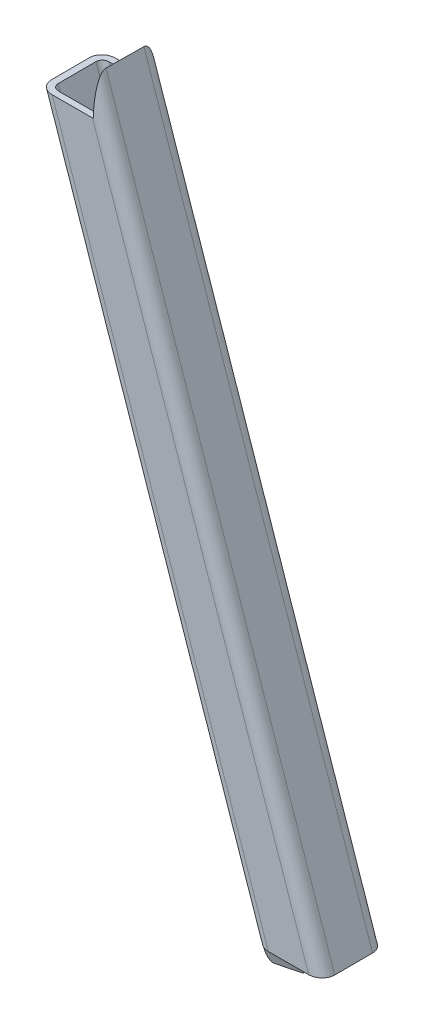
ISO-10303-21;
HEADER;
FILE_DESCRIPTION(('STEP AP214'),'2;1');
FILE_NAME('part.step','',(''),(''),'','','');
FILE_SCHEMA(('AUTOMOTIVE_DESIGN { 1 0 10303 214 1 1 1 1 }'));
ENDSEC;
DATA;
#1=APPLICATION_CONTEXT('core data for automotive mechanical design processes');
#2=APPLICATION_PROTOCOL_DEFINITION('international standard','automotive_design',2000,#1);
#3=PRODUCT_CONTEXT('',#1,'mechanical');
#4=PRODUCT('Part','Part','',(#3));
#5=PRODUCT_RELATED_PRODUCT_CATEGORY('part','',(#4));
#6=PRODUCT_DEFINITION_FORMATION('','',#4);
#7=PRODUCT_DEFINITION_CONTEXT('part definition',#1,'design');
#8=PRODUCT_DEFINITION('design','',#6,#7);
#9=PRODUCT_DEFINITION_SHAPE('','',#8);
#10=(LENGTH_UNIT() NAMED_UNIT(*) SI_UNIT(.MILLI.,.METRE.));
#11=(NAMED_UNIT(*) PLANE_ANGLE_UNIT() SI_UNIT($,.RADIAN.));
#12=(NAMED_UNIT(*) SI_UNIT($,.STERADIAN.) SOLID_ANGLE_UNIT());
#13=UNCERTAINTY_MEASURE_WITH_UNIT(LENGTH_MEASURE(1.E-05),#10,'distance_accuracy_value','');
#14=(GEOMETRIC_REPRESENTATION_CONTEXT(3) GLOBAL_UNCERTAINTY_ASSIGNED_CONTEXT((#13)) GLOBAL_UNIT_ASSIGNED_CONTEXT((#10,
#11,#12)) REPRESENTATION_CONTEXT('',''));
#15=CARTESIAN_POINT('',(0.,0.,0.));
#16=DIRECTION('',(0.,0.,1.));
#17=DIRECTION('',(1.,0.,0.));
#18=AXIS2_PLACEMENT_3D('',#15,#16,#17);
#19=CARTESIAN_POINT('',(-240.552316834698,223.22080107908,-2006.03056574602));
#20=DIRECTION('',(-0.946505758584915,-0.322672417699403,0.00305938255488657));
#21=DIRECTION('',(0.322673927788139,-0.94651018817854,0.));
#22=AXIS2_PLACEMENT_3D('',#19,#20,#21);
#23=PLANE('',#22);
#24=DIRECTION('',(0.,-0.00948096236960193,-0.999955054666231));
#25=VECTOR('',#24,1.);
#26=CARTESIAN_POINT('',(-240.,221.600817328539,-2006.01520605069));
#27=LINE('',#26,#25);
#28=CARTESIAN_POINT('',(-240.,221.714447827,-1994.03062190508));
#29=VERTEX_POINT('',#28);
#30=CARTESIAN_POINT('',(-240.,221.6006716973,-2006.03056574602));
#31=VERTEX_POINT('',#30);
#32=EDGE_CURVE('E298',#29,#31,#27,.T.);
#33=ORIENTED_EDGE('',*,*,#32,.F.);
#34=DIRECTION('',(0.322673927788139,-0.94651018817854,0.));
#35=VECTOR('',#34,1.);
#36=CARTESIAN_POINT('',(-240.517567993605,223.232647274908,-1994.03062190508));
#37=LINE('',#36,#35);
#38=CARTESIAN_POINT('',(-167.824620058977,10.,-1994.03062190508));
#39=VERTEX_POINT('',#38);
#40=EDGE_CURVE('E254',#29,#39,#37,.T.);
#41=ORIENTED_EDGE('',*,*,#40,.T.);
#42=DIRECTION('',(0.00323227465389861,0.,0.999994776186637));
#43=VECTOR('',#42,1.);
#44=CARTESIAN_POINT('',(-167.86416680053,10.,-2006.26551503834));
#45=LINE('',#44,#43);
#46=CARTESIAN_POINT('',(-167.86340737592,10.,-2006.03056574602));
#47=VERTEX_POINT('',#46);
#48=EDGE_CURVE('E276',#47,#39,#45,.T.);
#49=ORIENTED_EDGE('',*,*,#48,.F.);
#50=DIRECTION('',(0.322673927788139,-0.94651018817854,0.));
#51=VECTOR('',#50,1.);
#52=CARTESIAN_POINT('',(-240.552316834698,223.22080107908,-2006.03056574602));
#53=LINE('',#52,#51);
#54=EDGE_CURVE('E251',#31,#47,#53,.T.);
#55=ORIENTED_EDGE('',*,*,#54,.F.);
#56=EDGE_LOOP('',(#33,#41,#49,#55));
#57=FACE_BOUND('',#56,.T.);
#58=ADVANCED_FACE('F41',(#57),#23,.F.);
#59=CARTESIAN_POINT('',(-244.303591027944,221.94195760411,-1994.01838437486));
#60=DIRECTION('',(0.322673927788139,-0.94651018817854,0.));
#61=DIRECTION('',(0.94651018817854,0.322673927788139,0.));
#62=AXIS2_PLACEMENT_3D('',#59,#60,#61);
#63=CYLINDRICAL_SURFACE('',#62,3.99999999999994);
#64=CARTESIAN_POINT('',(-240.232469117452,210.,-1994.01838437486));
#65=DIRECTION('',(0.,1.,0.));
#66=DIRECTION('',(1.,0.,0.));
#67=AXIS2_PLACEMENT_3D('',#64,#65,#66);
#68=ELLIPSE('',#67,4.22605065424338,3.99999999999994);
#69=CARTESIAN_POINT('',(-240.219540011804,210.,-1990.01840309455));
#70=VERTEX_POINT('',#69);
#71=CARTESIAN_POINT('',(-240.,210.,-1990.02444085147));
#72=VERTEX_POINT('',#71);
#73=EDGE_CURVE('E237',#70,#72,#68,.T.);
#74=ORIENTED_EDGE('',*,*,#73,.F.);
#75=DIRECTION('',(0.322673927788139,-0.94651018817854,0.));
#76=VECTOR('',#75,1.);
#77=CARTESIAN_POINT('',(-244.292008080913,221.945906336053,-1990.01840309455));
#78=LINE('',#77,#76);
#79=CARTESIAN_POINT('',(-172.037721829986,10.,-1990.01840309455));
#80=VERTEX_POINT('',#79);
#81=EDGE_CURVE('E258',#70,#80,#78,.T.);
#82=ORIENTED_EDGE('',*,*,#81,.T.);
#83=CARTESIAN_POINT('',(-172.050650935634,10.,-1994.01838437486));
#84=DIRECTION('',(0.,-1.,0.));
#85=DIRECTION('',(1.,0.,0.));
#86=AXIS2_PLACEMENT_3D('',#83,#84,#85);
#87=ELLIPSE('',#86,4.22605065424338,3.99999999999994);
#88=EDGE_CURVE('E198',#39,#80,#87,.T.);
#89=ORIENTED_EDGE('',*,*,#88,.F.);
#90=ORIENTED_EDGE('',*,*,#40,.F.);
#91=CARTESIAN_POINT('',(-240.,209.318090588806,-1994.01838437486));
#92=DIRECTION('',(-1.,0.,0.));
#93=DIRECTION('',(0.,-1.,0.));
#94=AXIS2_PLACEMENT_3D('',#91,#92,#93);
#95=ELLIPSE('',#94,12.3964152524472,3.99999999999994);
#96=EDGE_CURVE('E193',#72,#29,#95,.T.);
#97=ORIENTED_EDGE('',*,*,#96,.F.);
#98=EDGE_LOOP('',(#74,#82,#89,#90,#97));
#99=FACE_BOUND('',#98,.T.);
#100=ADVANCED_FACE('F368',(#99),#63,.T.);
#101=CARTESIAN_POINT('',(-255.650077183932,218.073837323659,-1989.98169050389));
#102=DIRECTION('',(-0.00289573675775556,-0.000987182985598488,-0.99999532007824));
#103=DIRECTION('',(-0.99999580734144,0.,0.00289573816874812));
#104=AXIS2_PLACEMENT_3D('',#101,#102,#103);
#105=PLANE('',#104);
#106=DIRECTION('',(0.99999580734144,0.,-0.00289573816874812));
#107=VECTOR('',#106,1.);
#108=CARTESIAN_POINT('',(-255.65005410386,210.,-1989.97372017859));
#109=LINE('',#108,#107);
#110=CARTESIAN_POINT('',(-252.897632641749,210.,-1989.98169050389));
#111=VERTEX_POINT('',#110);
#112=EDGE_CURVE('E239',#111,#70,#109,.T.);
#113=ORIENTED_EDGE('',*,*,#112,.F.);
#114=DIRECTION('',(0.322673927788139,-0.94651018817854,0.));
#115=VECTOR('',#114,1.);
#116=CARTESIAN_POINT('',(-255.650077183932,218.073837323659,-1989.98169050389));
#117=LINE('',#116,#115);
#118=CARTESIAN_POINT('',(-184.715814459964,10.,-1989.98169050389));
#119=VERTEX_POINT('',#118);
#120=EDGE_CURVE('E261',#111,#119,#117,.T.);
#121=ORIENTED_EDGE('',*,*,#120,.T.);
#122=DIRECTION('',(-0.99999580734144,0.,0.00289573816874812));
#123=VECTOR('',#122,1.);
#124=CARTESIAN_POINT('',(-255.649482378891,10.,-1989.77628431305));
#125=LINE('',#124,#123);
#126=EDGE_CURVE('E556',#80,#119,#125,.T.);
#127=ORIENTED_EDGE('',*,*,#126,.F.);
#128=ORIENTED_EDGE('',*,*,#81,.F.);
#129=EDGE_LOOP('',(#113,#121,#127,#128));
#130=FACE_BOUND('',#129,.T.);
#131=ADVANCED_FACE('F375',(#130),#105,.F.);
#132=CARTESIAN_POINT('',(-255.661660130963,218.069888591717,-1993.9816717842));
#133=DIRECTION('',(0.322673927788139,-0.94651018817854,0.));
#134=DIRECTION('',(0.94651018817854,0.322673927788139,0.));
#135=AXIS2_PLACEMENT_3D('',#132,#133,#134);
#136=CYLINDRICAL_SURFACE('',#135,3.99999999999996);
#137=CARTESIAN_POINT('',(-252.910561747424,210.,-1993.9816717842));
#138=DIRECTION('',(0.,1.,0.));
#139=DIRECTION('',(1.,0.,0.));
#140=AXIS2_PLACEMENT_3D('',#137,#138,#139);
#141=ELLIPSE('',#140,4.2260506542434,3.99999999999996);
#142=CARTESIAN_POINT('',(-257.13659262408,210.,-1993.96943425398));
#143=VERTEX_POINT('',#142);
#144=EDGE_CURVE('E241',#143,#111,#141,.T.);
#145=ORIENTED_EDGE('',*,*,#144,.F.);
#146=DIRECTION('',(0.322673927788139,-0.94651018817854,0.));
#147=VECTOR('',#146,1.);
#148=CARTESIAN_POINT('',(-259.447683165303,216.779198920919,-1993.96943425398));
#149=LINE('',#148,#147);
#150=CARTESIAN_POINT('',(-186.815405500549,3.72451777097563,-1993.96943425398));
#151=VERTEX_POINT('',#150);
#152=EDGE_CURVE('E264',#143,#151,#149,.T.);
#153=ORIENTED_EDGE('',*,*,#152,.T.);
#154=CARTESIAN_POINT('',(-186.812346117994,16.1119008203405,-1993.9816717842));
#155=DIRECTION('',(0.970142500145332,0.,0.242535625036333));
#156=DIRECTION('',(0.0199852784923983,-0.996599220820928,-0.0799411139695933));
#157=AXIS2_PLACEMENT_3D('',#154,#155,#156);
#158=ELLIPSE('',#157,12.7779323662145,3.99999999999996);
#159=CARTESIAN_POINT('',(-187.555672242524,10.,-1991.00836728608));
#160=VERTEX_POINT('',#159);
#161=EDGE_CURVE('E218',#160,#151,#158,.T.);
#162=ORIENTED_EDGE('',*,*,#161,.F.);
#163=CARTESIAN_POINT('',(-184.728743565605,10.,-1993.9816717842));
#164=DIRECTION('',(0.,-1.,0.));
#165=DIRECTION('',(1.,0.,0.));
#166=AXIS2_PLACEMENT_3D('',#163,#164,#165);
#167=ELLIPSE('',#166,4.2260506542434,3.99999999999996);
#168=EDGE_CURVE('E558',#119,#160,#167,.T.);
#169=ORIENTED_EDGE('',*,*,#168,.F.);
#170=ORIENTED_EDGE('',*,*,#120,.F.);
#171=EDGE_LOOP('',(#145,#153,#162,#169,#170));
#172=FACE_BOUND('',#171,.T.);
#173=ADVANCED_FACE('F383',(#172),#136,.T.);
#174=CARTESIAN_POINT('',(-259.447683165303,216.779198920919,-1993.96943425398));
#175=DIRECTION('',(0.946505758584915,0.322672417699403,-0.00305938255488657));
#176=DIRECTION('',(-0.322673927788139,0.94651018817854,0.));
#177=AXIS2_PLACEMENT_3D('',#174,#175,#176);
#178=PLANE('',#177);
#179=DIRECTION('',(0.00323227465389861,0.,0.999994776186637));
#180=VECTOR('',#179,1.);
#181=CARTESIAN_POINT('',(-257.136616769428,210.,-1993.97690429434));
#182=LINE('',#181,#180);
#183=CARTESIAN_POINT('',(-257.175379941023,210.,-2005.96937809492));
#184=VERTEX_POINT('',#183);
#185=EDGE_CURVE('E243',#184,#143,#182,.T.);
#186=ORIENTED_EDGE('',*,*,#185,.F.);
#187=DIRECTION('',(0.322673927788139,-0.94651018817854,0.));
#188=VECTOR('',#187,1.);
#189=CARTESIAN_POINT('',(-259.482432006396,216.767352725092,-2005.96937809492));
#190=LINE('',#189,#188);
#191=CARTESIAN_POINT('',(-184.999999999999,-1.71444782700282,-2005.96937809492));
#192=VERTEX_POINT('',#191);
#193=EDGE_CURVE('E267',#184,#192,#190,.T.);
#194=ORIENTED_EDGE('',*,*,#193,.T.);
#195=DIRECTION('',(0.,-0.00948096236960139,-0.999955054666231));
#196=VECTOR('',#195,1.);
#197=CARTESIAN_POINT('',(-184.999999999999,-1.58104182610241,-1991.8990759755));
#198=LINE('',#197,#196);
#199=CARTESIAN_POINT('',(-184.999999999999,-1.66952195674643,-2001.23105625618));
#200=VERTEX_POINT('',#199);
#201=EDGE_CURVE('E205',#200,#192,#198,.T.);
#202=ORIENTED_EDGE('',*,*,#201,.F.);
#203=DIRECTION('',(0.196766618222746,-0.584644563135699,-0.787066472890983));
#204=VECTOR('',#203,1.);
#205=CARTESIAN_POINT('',(-214.137014892352,84.9040924941265,-1884.68299668677));
#206=LINE('',#205,#204);
#207=EDGE_CURVE('E220',#151,#200,#206,.T.);
#208=ORIENTED_EDGE('',*,*,#207,.F.);
#209=ORIENTED_EDGE('',*,*,#152,.F.);
#210=EDGE_LOOP('',(#186,#194,#202,#208,#209));
#211=FACE_BOUND('',#210,.T.);
#212=ADVANCED_FACE('F387',(#211),#178,.F.);
#213=CARTESIAN_POINT('',(-255.696408972056,218.05804239589,-2005.98161562514));
#214=DIRECTION('',(0.322673927788139,-0.94651018817854,0.));
#215=DIRECTION('',(0.94651018817854,0.322673927788139,0.));
#216=AXIS2_PLACEMENT_3D('',#213,#214,#215);
#217=CYLINDRICAL_SURFACE('',#216,3.99999999999994);
#218=CARTESIAN_POINT('',(-252.949349064366,210.,-2005.98161562514));
#219=DIRECTION('',(0.,1.,0.));
#220=DIRECTION('',(1.,0.,0.));
#221=AXIS2_PLACEMENT_3D('',#218,#219,#220);
#222=ELLIPSE('',#221,4.22605065424338,3.99999999999994);
#223=CARTESIAN_POINT('',(-252.962278170014,210.,-2009.98159690545));
#224=VERTEX_POINT('',#223);
#225=EDGE_CURVE('E245',#224,#184,#222,.T.);
#226=ORIENTED_EDGE('',*,*,#225,.F.);
#227=DIRECTION('',(0.322673927788139,-0.94651018817854,0.));
#228=VECTOR('',#227,1.);
#229=CARTESIAN_POINT('',(-255.707991919087,218.054093663948,-2009.98159690545));
#230=LINE('',#229,#228);
#231=CARTESIAN_POINT('',(-184.78045998835,10.,-2009.98159690545));
#232=VERTEX_POINT('',#231);
#233=EDGE_CURVE('E270',#224,#232,#230,.T.);
#234=ORIENTED_EDGE('',*,*,#233,.T.);
#235=CARTESIAN_POINT('',(-184.767530882548,10.,-2005.98161562514));
#236=DIRECTION('',(0.,-1.,0.));
#237=DIRECTION('',(1.,0.,0.));
#238=AXIS2_PLACEMENT_3D('',#235,#236,#237);
#239=ELLIPSE('',#238,4.22605065424338,3.99999999999994);
#240=CARTESIAN_POINT('',(-184.999999999999,10.,-2009.97555914853));
#241=VERTEX_POINT('',#240);
#242=EDGE_CURVE('E319',#241,#232,#239,.T.);
#243=ORIENTED_EDGE('',*,*,#242,.F.);
#244=CARTESIAN_POINT('',(-184.999999999999,10.6819094111903,-2005.98161562514));
#245=DIRECTION('',(1.,0.,0.));
#246=DIRECTION('',(0.,-1.,0.));
#247=AXIS2_PLACEMENT_3D('',#244,#245,#246);
#248=ELLIPSE('',#247,12.3964152524472,3.99999999999994);
#249=EDGE_CURVE('E197',#192,#241,#248,.T.);
#250=ORIENTED_EDGE('',*,*,#249,.F.);
#251=ORIENTED_EDGE('',*,*,#193,.F.);
#252=EDGE_LOOP('',(#226,#234,#243,#250,#251));
#253=FACE_BOUND('',#252,.T.);
#254=ADVANCED_FACE('F391',(#253),#217,.T.);
#255=CARTESIAN_POINT('',(-244.349922816068,221.92616267634,-2010.01830949611));
#256=DIRECTION('',(0.00289573675775556,0.000987182985598488,0.99999532007824));
#257=DIRECTION('',(0.99999580734144,0.,-0.00289573816874812));
#258=AXIS2_PLACEMENT_3D('',#255,#256,#257);
#259=PLANE('',#258);
#260=DIRECTION('',(-0.99999580734144,0.,0.00289573816874812));
#261=VECTOR('',#260,1.);
#262=CARTESIAN_POINT('',(-244.349888723643,210.,-2010.00653623486));
#263=LINE('',#262,#261);
#264=CARTESIAN_POINT('',(-240.284185539927,210.,-2010.01830949611));
#265=VERTEX_POINT('',#264);
#266=EDGE_CURVE('E247',#265,#224,#263,.T.);
#267=ORIENTED_EDGE('',*,*,#266,.F.);
#268=DIRECTION('',(0.322673927788139,-0.94651018817854,0.));
#269=VECTOR('',#268,1.);
#270=CARTESIAN_POINT('',(-244.349922816068,221.92616267634,-2010.01830949611));
#271=LINE('',#270,#269);
#272=CARTESIAN_POINT('',(-172.102367358225,10.,-2010.01830949611));
#273=VERTEX_POINT('',#272);
#274=EDGE_CURVE('E273',#265,#273,#271,.T.);
#275=ORIENTED_EDGE('',*,*,#274,.T.);
#276=DIRECTION('',(0.99999580734144,0.,-0.00289573816874812));
#277=VECTOR('',#276,1.);
#278=CARTESIAN_POINT('',(-244.349316998674,10.,-2009.80910036932));
#279=LINE('',#278,#277);
#280=EDGE_CURVE('E323',#232,#273,#279,.T.);
#281=ORIENTED_EDGE('',*,*,#280,.F.);
#282=ORIENTED_EDGE('',*,*,#233,.F.);
#283=EDGE_LOOP('',(#267,#275,#281,#282));
#284=FACE_BOUND('',#283,.T.);
#285=ADVANCED_FACE('F395',(#284),#259,.F.);
#286=CARTESIAN_POINT('',(-244.338339869037,221.930111408283,-2006.0183282158));
#287=DIRECTION('',(0.322673927788139,-0.94651018817854,0.));
#288=DIRECTION('',(0.94651018817854,0.322673927788139,0.));
#289=AXIS2_PLACEMENT_3D('',#286,#287,#288);
#290=CYLINDRICAL_SURFACE('',#289,3.99999999999996);
#291=CARTESIAN_POINT('',(-240.271256434395,210.,-2006.0183282158));
#292=DIRECTION('',(0.,1.,0.));
#293=DIRECTION('',(1.,0.,0.));
#294=AXIS2_PLACEMENT_3D('',#291,#292,#293);
#295=ELLIPSE('',#294,4.2260506542434,3.99999999999996);
#296=CARTESIAN_POINT('',(-240.,210.,-2010.01007983494));
#297=VERTEX_POINT('',#296);
#298=EDGE_CURVE('E249',#297,#265,#295,.T.);
#299=ORIENTED_EDGE('',*,*,#298,.F.);
#300=CARTESIAN_POINT('',(-240.,209.204314459108,-2006.0183282158));
#301=DIRECTION('',(-1.,0.,0.));
#302=DIRECTION('',(0.,-1.,0.));
#303=AXIS2_PLACEMENT_3D('',#300,#301,#302);
#304=ELLIPSE('',#303,12.3964152524473,3.99999999999996);
#305=EDGE_CURVE('E337',#31,#297,#304,.T.);
#306=ORIENTED_EDGE('',*,*,#305,.F.);
#307=ORIENTED_EDGE('',*,*,#54,.T.);
#308=CARTESIAN_POINT('',(-172.089438252577,10.,-2006.0183282158));
#309=DIRECTION('',(0.,-1.,0.));
#310=DIRECTION('',(1.,0.,0.));
#311=AXIS2_PLACEMENT_3D('',#308,#309,#310);
#312=ELLIPSE('',#311,4.2260506542434,3.99999999999996);
#313=EDGE_CURVE('E560',#273,#47,#312,.T.);
#314=ORIENTED_EDGE('',*,*,#313,.F.);
#315=ORIENTED_EDGE('',*,*,#274,.F.);
#316=EDGE_LOOP('',(#299,#306,#307,#314,#315));
#317=FACE_BOUND('',#316,.T.);
#318=ADVANCED_FACE('F399',(#317),#290,.T.);
#319=CARTESIAN_POINT('',(-184.701425001453,6.00000000000001,-2002.42535625036));
#320=DIRECTION('',(0.970142500145332,0.,0.242535625036333));
#321=DIRECTION('',(0.242535625036333,0.,-0.970142500145332));
#322=AXIS2_PLACEMENT_3D('',#319,#320,#321);
#323=PLANE('',#322);
#324=ORIENTED_EDGE('',*,*,#207,.T.);
#325=DIRECTION('',(0.,-1.,0.));
#326=VECTOR('',#325,1.);
#327=CARTESIAN_POINT('',(-184.999999999999,-6.00000000000001,-2001.23105625618));
#328=LINE('',#327,#326);
#329=CARTESIAN_POINT('',(-184.999999999999,4.5287146767389,-2001.23105625618));
#330=VERTEX_POINT('',#329);
#331=EDGE_CURVE('E311',#330,#200,#328,.T.);
#332=ORIENTED_EDGE('',*,*,#331,.F.);
#333=DIRECTION('',(0.196766618222735,-0.584644563135758,-0.787066472890941));
#334=VECTOR('',#333,1.);
#335=CARTESIAN_POINT('',(-213.423978839438,88.9837144183742,-1887.53514089843));
#336=LINE('',#335,#334);
#337=CARTESIAN_POINT('',(-186.813875809272,9.91820929565883,-1993.97555301909));
#338=VERTEX_POINT('',#337);
#339=EDGE_CURVE('E49',#338,#330,#336,.T.);
#340=ORIENTED_EDGE('',*,*,#339,.F.);
#341=CARTESIAN_POINT('',(-186.812346117994,16.1119008203405,-1993.9816717842));
#342=DIRECTION('',(0.970142500145332,0.,0.242535625036333));
#343=DIRECTION('',(0.0199852784923983,-0.996599220820928,-0.0799411139695933));
#344=AXIS2_PLACEMENT_3D('',#341,#342,#343);
#345=ELLIPSE('',#344,6.38896618310689,1.99999999999987);
#346=CARTESIAN_POINT('',(-186.838807677418,10.,-1993.87582554651));
#347=VERTEX_POINT('',#346);
#348=EDGE_CURVE('E215',#347,#338,#345,.T.);
#349=ORIENTED_EDGE('',*,*,#348,.F.);
#350=DIRECTION('',(-0.242535625036333,0.,0.970142500145332));
#351=VECTOR('',#350,1.);
#352=CARTESIAN_POINT('',(-184.701425001453,10.,-2002.42535625036));
#353=LINE('',#352,#351);
#354=EDGE_CURVE('E551',#347,#160,#353,.T.);
#355=ORIENTED_EDGE('',*,*,#354,.T.);
#356=ORIENTED_EDGE('',*,*,#161,.T.);
#357=EDGE_LOOP('',(#324,#332,#340,#349,#355,#356));
#358=FACE_BOUND('',#357,.T.);
#359=ADVANCED_FACE('F307',(#358),#323,.T.);
#360=CARTESIAN_POINT('',(-184.999999999999,-6.00000000000001,-2000.));
#361=DIRECTION('',(1.,0.,0.));
#362=DIRECTION('',(0.,0.,-1.));
#363=AXIS2_PLACEMENT_3D('',#360,#361,#362);
#364=PLANE('',#363);
#365=ORIENTED_EDGE('',*,*,#249,.T.);
#366=DIRECTION('',(0.,0.,-1.));
#367=VECTOR('',#366,1.);
#368=CARTESIAN_POINT('',(-184.999999999999,10.,-2000.));
#369=LINE('',#368,#367);
#370=CARTESIAN_POINT('',(-184.999999999999,10.,-2007.96947499342));
#371=VERTEX_POINT('',#370);
#372=EDGE_CURVE('E186',#371,#241,#369,.T.);
#373=ORIENTED_EDGE('',*,*,#372,.F.);
#374=CARTESIAN_POINT('',(-184.999999999999,10.6819094111903,-2005.98161562514));
#375=DIRECTION('',(1.,0.,0.));
#376=DIRECTION('',(0.,-1.,0.));
#377=AXIS2_PLACEMENT_3D('',#374,#375,#376);
#378=ELLIPSE('',#377,6.19820762622395,2.00000000000008);
#379=CARTESIAN_POINT('',(-184.999999999999,4.48373079209277,-2005.97549686003));
#380=VERTEX_POINT('',#379);
#381=EDGE_CURVE('E56',#380,#371,#378,.T.);
#382=ORIENTED_EDGE('',*,*,#381,.F.);
#383=DIRECTION('',(0.,-0.00948096236971599,-0.99995505466623));
#384=VECTOR('',#383,1.);
#385=CARTESIAN_POINT('',(-184.999999999999,4.61663765627662,-1991.95783858253));
#386=LINE('',#385,#384);
#387=EDGE_CURVE('E300',#330,#380,#386,.T.);
#388=ORIENTED_EDGE('',*,*,#387,.F.);
#389=ORIENTED_EDGE('',*,*,#331,.T.);
#390=ORIENTED_EDGE('',*,*,#201,.T.);
#391=EDGE_LOOP('',(#365,#373,#382,#388,#389,#390));
#392=FACE_BOUND('',#391,.T.);
#393=ADVANCED_FACE('F195',(#392),#364,.T.);
#394=CARTESIAN_POINT('',(-143.999999999999,10.,-200.));
#395=DIRECTION('',(0.,-1.,0.));
#396=DIRECTION('',(0.,0.,-1.));
#397=AXIS2_PLACEMENT_3D('',#394,#395,#396);
#398=PLANE('',#397);
#399=ORIENTED_EDGE('',*,*,#372,.T.);
#400=ORIENTED_EDGE('',*,*,#242,.T.);
#401=ORIENTED_EDGE('',*,*,#280,.T.);
#402=ORIENTED_EDGE('',*,*,#313,.T.);
#403=ORIENTED_EDGE('',*,*,#48,.T.);
#404=ORIENTED_EDGE('',*,*,#88,.T.);
#405=ORIENTED_EDGE('',*,*,#126,.T.);
#406=ORIENTED_EDGE('',*,*,#168,.T.);
#407=ORIENTED_EDGE('',*,*,#354,.F.);
#408=CARTESIAN_POINT('',(-184.728743565605,10.,-1993.9816717842));
#409=DIRECTION('',(0.,-1.,0.));
#410=DIRECTION('',(1.,0.,0.));
#411=AXIS2_PLACEMENT_3D('',#408,#409,#410);
#412=ELLIPSE('',#411,2.11302532712158,1.99999999999987);
#413=CARTESIAN_POINT('',(-184.722279012781,10.,-1991.98168114404));
#414=VERTEX_POINT('',#413);
#415=EDGE_CURVE('E315',#414,#347,#412,.T.);
#416=ORIENTED_EDGE('',*,*,#415,.F.);
#417=DIRECTION('',(-0.99999580734144,0.,0.00289573816874812));
#418=VECTOR('',#417,1.);
#419=CARTESIAN_POINT('',(-255.655273858051,10.,-1991.77627690226));
#420=LINE('',#419,#418);
#421=CARTESIAN_POINT('',(-172.044186382842,10.,-1992.0183937347));
#422=VERTEX_POINT('',#421);
#423=EDGE_CURVE('E318',#422,#414,#420,.T.);
#424=ORIENTED_EDGE('',*,*,#423,.F.);
#425=CARTESIAN_POINT('',(-172.050650935634,10.,-1994.01838437486));
#426=DIRECTION('',(0.,-1.,0.));
#427=DIRECTION('',(1.,0.,0.));
#428=AXIS2_PLACEMENT_3D('',#425,#426,#427);
#429=ELLIPSE('',#428,2.1130253271218,2.00000000000008);
#430=CARTESIAN_POINT('',(-169.937635497305,10.,-1994.02450313997));
#431=VERTEX_POINT('',#430);
#432=EDGE_CURVE('E321',#431,#422,#429,.T.);
#433=ORIENTED_EDGE('',*,*,#432,.F.);
#434=DIRECTION('',(0.00323227465393768,0.,0.999994776186637));
#435=VECTOR('',#434,1.);
#436=CARTESIAN_POINT('',(-169.977179940345,10.,-2006.25868516385));
#437=LINE('',#436,#435);
#438=CARTESIAN_POINT('',(-169.976422814249,10.,-2006.02444698091));
#439=VERTEX_POINT('',#438);
#440=EDGE_CURVE('E329',#439,#431,#437,.T.);
#441=ORIENTED_EDGE('',*,*,#440,.F.);
#442=CARTESIAN_POINT('',(-172.089438252577,10.,-2006.0183282158));
#443=DIRECTION('',(0.,-1.,0.));
#444=DIRECTION('',(1.,0.,0.));
#445=AXIS2_PLACEMENT_3D('',#442,#443,#444);
#446=ELLIPSE('',#445,2.11302532712158,1.99999999999987);
#447=CARTESIAN_POINT('',(-172.095902805401,10.,-2008.01831885596));
#448=VERTEX_POINT('',#447);
#449=EDGE_CURVE('E332',#448,#439,#446,.T.);
#450=ORIENTED_EDGE('',*,*,#449,.F.);
#451=DIRECTION('',(0.99999580734144,0.,-0.00289573816874812));
#452=VECTOR('',#451,1.);
#453=CARTESIAN_POINT('',(-244.343525519515,10.,-2007.80910778011));
#454=LINE('',#453,#452);
#455=CARTESIAN_POINT('',(-184.773995435494,10.,-2007.9816062653));
#456=VERTEX_POINT('',#455);
#457=EDGE_CURVE('E189',#456,#448,#454,.T.);
#458=ORIENTED_EDGE('',*,*,#457,.F.);
#459=CARTESIAN_POINT('',(-184.767530882548,10.,-2005.98161562514));
#460=DIRECTION('',(0.,-1.,0.));
#461=DIRECTION('',(1.,0.,0.));
#462=AXIS2_PLACEMENT_3D('',#459,#460,#461);
#463=ELLIPSE('',#462,2.1130253271218,2.00000000000008);
#464=EDGE_CURVE('E184',#371,#456,#463,.T.);
#465=ORIENTED_EDGE('',*,*,#464,.F.);
#466=EDGE_LOOP('',(#399,#400,#401,#402,#403,#404,#405,#406,#407,#416,#424,#433,#441,#450,#458,#465));
#467=FACE_BOUND('',#466,.T.);
#468=ADVANCED_FACE('F185',(#467),#398,.T.);
#469=CARTESIAN_POINT('',(-240.,214.,-2300.));
#470=DIRECTION('',(-1.,0.,0.));
#471=DIRECTION('',(0.,0.,1.));
#472=AXIS2_PLACEMENT_3D('',#469,#470,#471);
#473=PLANE('',#472);
#474=DIRECTION('',(0.,-0.00948096236971653,-0.99995505466623));
#475=VECTOR('',#474,1.);
#476=CARTESIAN_POINT('',(-240.,215.40313784616,-2005.95644344364));
#477=LINE('',#476,#475);
#478=CARTESIAN_POINT('',(-240.,215.516269207904,-1994.02450313997));
#479=VERTEX_POINT('',#478);
#480=CARTESIAN_POINT('',(-240.,215.402493078203,-2006.02444698091));
#481=VERTEX_POINT('',#480);
#482=EDGE_CURVE('E210',#479,#481,#477,.T.);
#483=ORIENTED_EDGE('',*,*,#482,.F.);
#484=CARTESIAN_POINT('',(-240.,209.318090588806,-1994.01838437486));
#485=DIRECTION('',(-1.,0.,0.));
#486=DIRECTION('',(0.,-1.,0.));
#487=AXIS2_PLACEMENT_3D('',#484,#485,#486);
#488=ELLIPSE('',#487,6.19820762622395,2.00000000000008);
#489=CARTESIAN_POINT('',(-240.,210.,-1992.03052500658));
#490=VERTEX_POINT('',#489);
#491=EDGE_CURVE('E339',#490,#479,#488,.T.);
#492=ORIENTED_EDGE('',*,*,#491,.F.);
#493=DIRECTION('',(0.,0.,1.));
#494=VECTOR('',#493,1.);
#495=CARTESIAN_POINT('',(-240.,210.,-2300.));
#496=LINE('',#495,#494);
#497=EDGE_CURVE('E546',#490,#72,#496,.T.);
#498=ORIENTED_EDGE('',*,*,#497,.T.);
#499=ORIENTED_EDGE('',*,*,#96,.T.);
#500=ORIENTED_EDGE('',*,*,#32,.T.);
#501=ORIENTED_EDGE('',*,*,#305,.T.);
#502=CARTESIAN_POINT('',(-240.,210.,-2008.00178000218));
#503=VERTEX_POINT('',#502);
#504=EDGE_CURVE('E199',#297,#503,#496,.T.);
#505=ORIENTED_EDGE('',*,*,#504,.T.);
#506=CARTESIAN_POINT('',(-240.,209.204314459108,-2006.0183282158));
#507=DIRECTION('',(-1.,0.,0.));
#508=DIRECTION('',(0.,-1.,0.));
#509=AXIS2_PLACEMENT_3D('',#506,#507,#508);
#510=ELLIPSE('',#509,6.1982076262233,1.99999999999987);
#511=EDGE_CURVE('E206',#481,#503,#510,.T.);
#512=ORIENTED_EDGE('',*,*,#511,.F.);
#513=EDGE_LOOP('',(#483,#492,#498,#499,#500,#501,#505,#512));
#514=FACE_BOUND('',#513,.T.);
#515=ADVANCED_FACE('F357',(#514),#473,.T.);
#516=CARTESIAN_POINT('',(-244.,210.,-2300.));
#517=DIRECTION('',(0.,1.,0.));
#518=DIRECTION('',(0.,0.,1.));
#519=AXIS2_PLACEMENT_3D('',#516,#517,#518);
#520=PLANE('',#519);
#521=ORIENTED_EDGE('',*,*,#298,.T.);
#522=ORIENTED_EDGE('',*,*,#266,.T.);
#523=ORIENTED_EDGE('',*,*,#225,.T.);
#524=ORIENTED_EDGE('',*,*,#185,.T.);
#525=ORIENTED_EDGE('',*,*,#144,.T.);
#526=ORIENTED_EDGE('',*,*,#112,.T.);
#527=ORIENTED_EDGE('',*,*,#73,.T.);
#528=ORIENTED_EDGE('',*,*,#497,.F.);
#529=CARTESIAN_POINT('',(-240.232469117452,210.,-1994.01838437486));
#530=DIRECTION('',(0.,1.,0.));
#531=DIRECTION('',(1.,0.,0.));
#532=AXIS2_PLACEMENT_3D('',#529,#530,#531);
#533=ELLIPSE('',#532,2.1130253271218,2.00000000000008);
#534=CARTESIAN_POINT('',(-240.226004564703,210.,-1992.0183937347));
#535=VERTEX_POINT('',#534);
#536=EDGE_CURVE('E226',#535,#490,#533,.T.);
#537=ORIENTED_EDGE('',*,*,#536,.F.);
#538=DIRECTION('',(0.99999580734144,0.,-0.00289573816874812));
#539=VECTOR('',#538,1.);
#540=CARTESIAN_POINT('',(-255.65584558302,210.,-1991.9737127678));
#541=LINE('',#540,#539);
#542=CARTESIAN_POINT('',(-252.904097194599,210.,-1991.98168114404));
#543=VERTEX_POINT('',#542);
#544=EDGE_CURVE('E223',#543,#535,#541,.T.);
#545=ORIENTED_EDGE('',*,*,#544,.F.);
#546=CARTESIAN_POINT('',(-252.910561747424,210.,-1993.9816717842));
#547=DIRECTION('',(0.,1.,0.));
#548=DIRECTION('',(1.,0.,0.));
#549=AXIS2_PLACEMENT_3D('',#546,#547,#548);
#550=ELLIPSE('',#549,2.11302532712158,1.99999999999987);
#551=CARTESIAN_POINT('',(-255.023577185752,210.,-1993.97555301909));
#552=VERTEX_POINT('',#551);
#553=EDGE_CURVE('E64',#552,#543,#550,.T.);
#554=ORIENTED_EDGE('',*,*,#553,.F.);
#555=DIRECTION('',(0.00323227465393768,0.,0.999994776186637));
#556=VECTOR('',#555,1.);
#557=CARTESIAN_POINT('',(-255.023603629613,210.,-1993.98373416883));
#558=LINE('',#557,#556);
#559=CARTESIAN_POINT('',(-255.062364502695,210.,-2005.97549686003));
#560=VERTEX_POINT('',#559);
#561=EDGE_CURVE('E11',#560,#552,#558,.T.);
#562=ORIENTED_EDGE('',*,*,#561,.F.);
#563=CARTESIAN_POINT('',(-252.949349064366,210.,-2005.98161562514));
#564=DIRECTION('',(0.,1.,0.));
#565=DIRECTION('',(1.,0.,0.));
#566=AXIS2_PLACEMENT_3D('',#563,#564,#565);
#567=ELLIPSE('',#566,2.1130253271218,2.00000000000008);
#568=CARTESIAN_POINT('',(-252.955813617191,210.,-2007.9816062653));
#569=VERTEX_POINT('',#568);
#570=EDGE_CURVE('E229',#569,#560,#567,.T.);
#571=ORIENTED_EDGE('',*,*,#570,.F.);
#572=DIRECTION('',(-0.99999580734144,0.,0.00289573816874812));
#573=VECTOR('',#572,1.);
#574=CARTESIAN_POINT('',(-244.344097244484,210.,-2008.00654364565));
#575=LINE('',#574,#573);
#576=CARTESIAN_POINT('',(-240.277720987225,210.,-2008.01831885596));
#577=VERTEX_POINT('',#576);
#578=EDGE_CURVE('E231',#577,#569,#575,.T.);
#579=ORIENTED_EDGE('',*,*,#578,.F.);
#580=CARTESIAN_POINT('',(-240.271256434395,210.,-2006.0183282158));
#581=DIRECTION('',(0.,1.,0.));
#582=DIRECTION('',(1.,0.,0.));
#583=AXIS2_PLACEMENT_3D('',#580,#581,#582);
#584=ELLIPSE('',#583,2.11302532712158,1.99999999999987);
#585=EDGE_CURVE('E234',#503,#577,#584,.T.);
#586=ORIENTED_EDGE('',*,*,#585,.F.);
#587=ORIENTED_EDGE('',*,*,#504,.F.);
#588=EDGE_LOOP('',(#521,#522,#523,#524,#525,#526,#527,#528,#537,#545,#554,#562,#571,#579,#586,#587));
#589=FACE_BOUND('',#588,.T.);
#590=ADVANCED_FACE('F352',(#589),#520,.T.);
#591=CARTESIAN_POINT('',(-257.554671648133,217.424543756318,-1993.97555301909));
#592=DIRECTION('',(0.946505758584915,0.322672417699403,-0.00305938255492355));
#593=DIRECTION('',(-0.322673927788139,0.94651018817854,0.));
#594=AXIS2_PLACEMENT_3D('',#591,#592,#593);
#595=PLANE('',#594);
#596=DIRECTION('',(0.322673927788139,-0.94651018817854,0.));
#597=VECTOR('',#596,1.);
#598=CARTESIAN_POINT('',(-257.589420489226,217.412697560491,-2005.97549686003));
#599=LINE('',#598,#597);
#600=EDGE_CURVE('E204',#560,#380,#599,.T.);
#601=ORIENTED_EDGE('',*,*,#600,.F.);
#602=ORIENTED_EDGE('',*,*,#561,.T.);
#603=DIRECTION('',(0.322673927788139,-0.94651018817854,0.));
#604=VECTOR('',#603,1.);
#605=CARTESIAN_POINT('',(-257.554671648133,217.424543756318,-1993.97555301909));
#606=LINE('',#605,#604);
#607=EDGE_CURVE('E278',#552,#338,#606,.T.);
#608=ORIENTED_EDGE('',*,*,#607,.T.);
#609=ORIENTED_EDGE('',*,*,#339,.T.);
#610=ORIENTED_EDGE('',*,*,#387,.T.);
#611=EDGE_LOOP('',(#601,#602,#608,#609,#610));
#612=FACE_BOUND('',#611,.T.);
#613=ADVANCED_FACE('F303',(#612),#595,.T.);
#614=CARTESIAN_POINT('',(-255.661660130963,218.069888591717,-1993.9816717842));
#615=DIRECTION('',(0.322673927788139,-0.94651018817854,0.));
#616=DIRECTION('',(0.94651018817854,0.322673927788139,0.));
#617=AXIS2_PLACEMENT_3D('',#614,#615,#616);
#618=CYLINDRICAL_SURFACE('',#617,1.99999999999987);
#619=ORIENTED_EDGE('',*,*,#607,.F.);
#620=ORIENTED_EDGE('',*,*,#553,.T.);
#621=DIRECTION('',(0.322673927788139,-0.94651018817854,0.));
#622=VECTOR('',#621,1.);
#623=CARTESIAN_POINT('',(-255.655868657448,218.071862957688,-1991.98168114404));
#624=LINE('',#623,#622);
#625=EDGE_CURVE('E281',#543,#414,#624,.T.);
#626=ORIENTED_EDGE('',*,*,#625,.T.);
#627=ORIENTED_EDGE('',*,*,#415,.T.);
#628=ORIENTED_EDGE('',*,*,#348,.T.);
#629=EDGE_LOOP('',(#619,#620,#626,#627,#628));
#630=FACE_BOUND('',#629,.T.);
#631=ADVANCED_FACE('F314',(#630),#618,.F.);
#632=CARTESIAN_POINT('',(-255.655868657448,218.071862957688,-1991.98168114404));
#633=DIRECTION('',(-0.00289573675775556,-0.000987182985598488,-0.99999532007824));
#634=DIRECTION('',(-0.99999580734144,0.,0.00289573816874812));
#635=AXIS2_PLACEMENT_3D('',#632,#633,#634);
#636=PLANE('',#635);
#637=ORIENTED_EDGE('',*,*,#625,.F.);
#638=ORIENTED_EDGE('',*,*,#544,.T.);
#639=DIRECTION('',(0.322673927788139,-0.94651018817854,0.));
#640=VECTOR('',#639,1.);
#641=CARTESIAN_POINT('',(-244.297799554429,221.943931970081,-1992.0183937347));
#642=LINE('',#641,#640);
#643=EDGE_CURVE('E284',#535,#422,#642,.T.);
#644=ORIENTED_EDGE('',*,*,#643,.T.);
#645=ORIENTED_EDGE('',*,*,#423,.T.);
#646=EDGE_LOOP('',(#637,#638,#644,#645));
#647=FACE_BOUND('',#646,.T.);
#648=ADVANCED_FACE('F406',(#647),#636,.T.);
#649=CARTESIAN_POINT('',(-244.303591027944,221.94195760411,-1994.01838437486));
#650=DIRECTION('',(0.322673927788139,-0.94651018817854,0.));
#651=DIRECTION('',(0.94651018817854,0.322673927788139,0.));
#652=AXIS2_PLACEMENT_3D('',#649,#650,#651);
#653=CYLINDRICAL_SURFACE('',#652,2.00000000000008);
#654=ORIENTED_EDGE('',*,*,#643,.F.);
#655=ORIENTED_EDGE('',*,*,#536,.T.);
#656=ORIENTED_EDGE('',*,*,#491,.T.);
#657=DIRECTION('',(0.322673927788139,-0.94651018817854,0.));
#658=VECTOR('',#657,1.);
#659=CARTESIAN_POINT('',(-242.410579510774,222.587302439509,-1994.02450313997));
#660=LINE('',#659,#658);
#661=EDGE_CURVE('E287',#479,#431,#660,.T.);
#662=ORIENTED_EDGE('',*,*,#661,.T.);
#663=ORIENTED_EDGE('',*,*,#432,.T.);
#664=EDGE_LOOP('',(#654,#655,#656,#662,#663));
#665=FACE_BOUND('',#664,.T.);
#666=ADVANCED_FACE('F409',(#665),#653,.F.);
#667=CARTESIAN_POINT('',(-242.445328351867,222.575456243682,-2006.02444698091));
#668=DIRECTION('',(-0.946505758584915,-0.322672417699403,0.00305938255492355));
#669=DIRECTION('',(0.322673927788139,-0.94651018817854,0.));
#670=AXIS2_PLACEMENT_3D('',#667,#668,#669);
#671=PLANE('',#670);
#672=ORIENTED_EDGE('',*,*,#661,.F.);
#673=ORIENTED_EDGE('',*,*,#482,.T.);
#674=DIRECTION('',(0.322673927788139,-0.94651018817854,0.));
#675=VECTOR('',#674,1.);
#676=CARTESIAN_POINT('',(-242.445328351867,222.575456243682,-2006.02444698091));
#677=LINE('',#676,#675);
#678=EDGE_CURVE('E290',#481,#439,#677,.T.);
#679=ORIENTED_EDGE('',*,*,#678,.T.);
#680=ORIENTED_EDGE('',*,*,#440,.T.);
#681=EDGE_LOOP('',(#672,#673,#679,#680));
#682=FACE_BOUND('',#681,.T.);
#683=ADVANCED_FACE('F345',(#682),#671,.T.);
#684=CARTESIAN_POINT('',(-244.338339869037,221.930111408283,-2006.0183282158));
#685=DIRECTION('',(0.322673927788139,-0.94651018817854,0.));
#686=DIRECTION('',(0.94651018817854,0.322673927788139,0.));
#687=AXIS2_PLACEMENT_3D('',#684,#685,#686);
#688=CYLINDRICAL_SURFACE('',#687,1.99999999999987);
#689=ORIENTED_EDGE('',*,*,#511,.T.);
#690=ORIENTED_EDGE('',*,*,#585,.T.);
#691=DIRECTION('',(0.322673927788139,-0.94651018817854,0.));
#692=VECTOR('',#691,1.);
#693=CARTESIAN_POINT('',(-244.344131342553,221.928137042312,-2008.01831885596));
#694=LINE('',#693,#692);
#695=EDGE_CURVE('E293',#577,#448,#694,.T.);
#696=ORIENTED_EDGE('',*,*,#695,.T.);
#697=ORIENTED_EDGE('',*,*,#449,.T.);
#698=ORIENTED_EDGE('',*,*,#678,.F.);
#699=EDGE_LOOP('',(#689,#690,#696,#697,#698));
#700=FACE_BOUND('',#699,.T.);
#701=ADVANCED_FACE('F348',(#700),#688,.F.);
#702=CARTESIAN_POINT('',(-244.344131342553,221.928137042312,-2008.01831885596));
#703=DIRECTION('',(0.00289573675775556,0.000987182985598488,0.99999532007824));
#704=DIRECTION('',(0.99999580734144,0.,-0.00289573816874812));
#705=AXIS2_PLACEMENT_3D('',#702,#703,#704);
#706=PLANE('',#705);
#707=ORIENTED_EDGE('',*,*,#695,.F.);
#708=ORIENTED_EDGE('',*,*,#578,.T.);
#709=DIRECTION('',(0.322673927788139,-0.94651018817854,0.));
#710=VECTOR('',#709,1.);
#711=CARTESIAN_POINT('',(-255.702200445572,218.056068029919,-2007.9816062653));
#712=LINE('',#711,#710);
#713=EDGE_CURVE('E255',#569,#456,#712,.T.);
#714=ORIENTED_EDGE('',*,*,#713,.T.);
#715=ORIENTED_EDGE('',*,*,#457,.T.);
#716=EDGE_LOOP('',(#707,#708,#714,#715));
#717=FACE_BOUND('',#716,.T.);
#718=ADVANCED_FACE('F351',(#717),#706,.T.);
#719=CARTESIAN_POINT('',(-255.696408972056,218.05804239589,-2005.98161562514));
#720=DIRECTION('',(0.322673927788139,-0.94651018817854,0.));
#721=DIRECTION('',(0.94651018817854,0.322673927788139,0.));
#722=AXIS2_PLACEMENT_3D('',#719,#720,#721);
#723=CYLINDRICAL_SURFACE('',#722,2.00000000000008);
#724=ORIENTED_EDGE('',*,*,#713,.F.);
#725=ORIENTED_EDGE('',*,*,#570,.T.);
#726=ORIENTED_EDGE('',*,*,#600,.T.);
#727=ORIENTED_EDGE('',*,*,#381,.T.);
#728=ORIENTED_EDGE('',*,*,#464,.T.);
#729=EDGE_LOOP('',(#724,#725,#726,#727,#728));
#730=FACE_BOUND('',#729,.T.);
#731=ADVANCED_FACE('F43',(#730),#723,.F.);
#732=CLOSED_SHELL('',(#58,#100,#131,#173,#212,#254,#285,#318,#359,#393,#468,#515,#590,#613,#631,
#648,#666,#683,#701,#718,#731));
#733=MANIFOLD_SOLID_BREP('B2',#732);
#734=ADVANCED_BREP_SHAPE_REPRESENTATION('',(#18,#733),#14);
#735=SHAPE_DEFINITION_REPRESENTATION(#9,#734);
ENDSEC;
END-ISO-10303-21;
